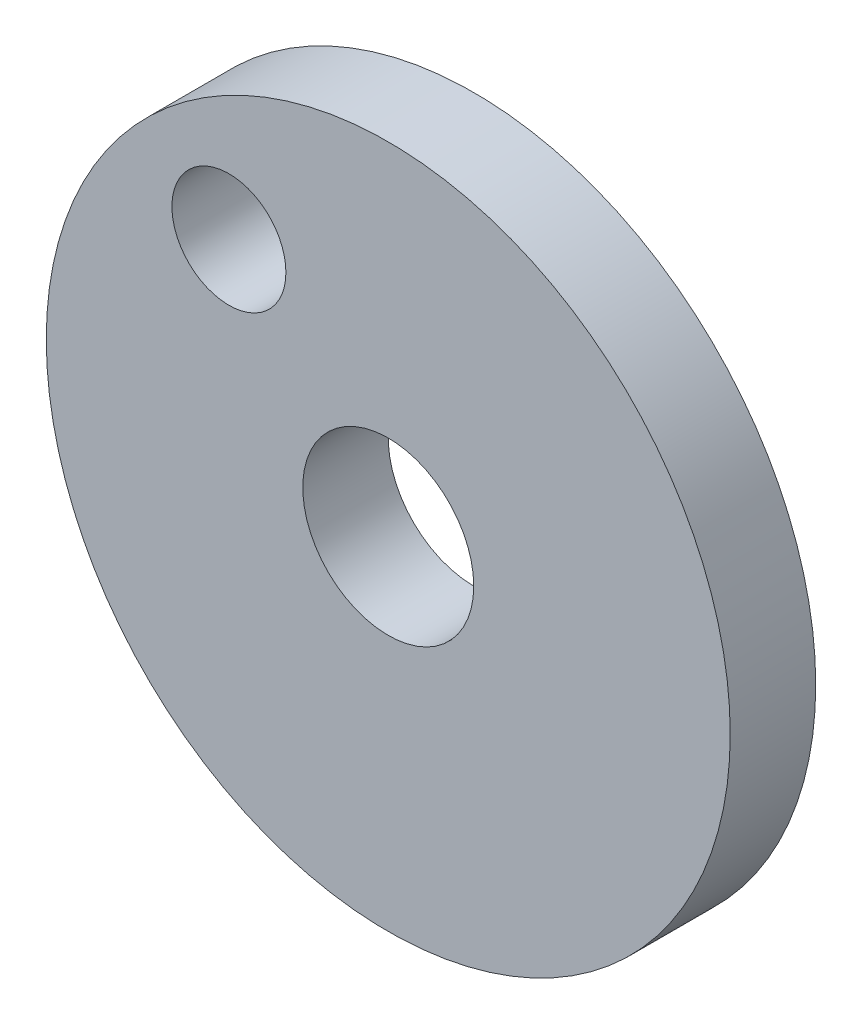
ISO-10303-21;
HEADER;
FILE_DESCRIPTION(('STEP AP214'),'2;1');
FILE_NAME('part.step','',(''),(''),'','','');
FILE_SCHEMA(('AUTOMOTIVE_DESIGN { 1 0 10303 214 1 1 1 1 }'));
ENDSEC;
DATA;
#1=APPLICATION_CONTEXT('core data for automotive mechanical design processes');
#2=APPLICATION_PROTOCOL_DEFINITION('international standard','automotive_design',2000,#1);
#3=PRODUCT_CONTEXT('',#1,'mechanical');
#4=PRODUCT('Part','Part','',(#3));
#5=PRODUCT_RELATED_PRODUCT_CATEGORY('part','',(#4));
#6=PRODUCT_DEFINITION_FORMATION('','',#4);
#7=PRODUCT_DEFINITION_CONTEXT('part definition',#1,'design');
#8=PRODUCT_DEFINITION('design','',#6,#7);
#9=PRODUCT_DEFINITION_SHAPE('','',#8);
#10=(LENGTH_UNIT() NAMED_UNIT(*) SI_UNIT(.MILLI.,.METRE.));
#11=(NAMED_UNIT(*) PLANE_ANGLE_UNIT() SI_UNIT($,.RADIAN.));
#12=(NAMED_UNIT(*) SI_UNIT($,.STERADIAN.) SOLID_ANGLE_UNIT());
#13=UNCERTAINTY_MEASURE_WITH_UNIT(LENGTH_MEASURE(1.E-05),#10,'distance_accuracy_value','');
#14=(GEOMETRIC_REPRESENTATION_CONTEXT(3) GLOBAL_UNCERTAINTY_ASSIGNED_CONTEXT((#13)) GLOBAL_UNIT_ASSIGNED_CONTEXT((#10,
#11,#12)) REPRESENTATION_CONTEXT('',''));
#15=CARTESIAN_POINT('',(0.,0.,0.));
#16=DIRECTION('',(0.,0.,1.));
#17=DIRECTION('',(1.,0.,0.));
#18=AXIS2_PLACEMENT_3D('',#15,#16,#17);
#19=CARTESIAN_POINT('',(0.,0.,15.));
#20=DIRECTION('',(0.,0.,-1.));
#21=DIRECTION('',(-1.,0.,0.));
#22=AXIS2_PLACEMENT_3D('',#19,#20,#21);
#23=CYLINDRICAL_SURFACE('',#22,60.);
#24=CARTESIAN_POINT('',(0.,0.,15.));
#25=DIRECTION('',(0.,0.,1.));
#26=DIRECTION('',(1.,0.,0.));
#27=AXIS2_PLACEMENT_3D('',#24,#25,#26);
#28=CIRCLE('',#27,60.);
#29=CARTESIAN_POINT('',(60.,0.,15.));
#30=VERTEX_POINT('',#29);
#31=EDGE_CURVE('E10',#30,#30,#28,.T.);
#32=ORIENTED_EDGE('',*,*,#31,.F.);
#33=EDGE_LOOP('',(#32));
#34=FACE_BOUND('',#33,.T.);
#35=CARTESIAN_POINT('',(0.,0.,0.));
#36=DIRECTION('',(0.,0.,1.));
#37=DIRECTION('',(1.,0.,0.));
#38=AXIS2_PLACEMENT_3D('',#35,#36,#37);
#39=CIRCLE('',#38,60.);
#40=CARTESIAN_POINT('',(60.,0.,0.));
#41=VERTEX_POINT('',#40);
#42=EDGE_CURVE('E40',#41,#41,#39,.T.);
#43=ORIENTED_EDGE('',*,*,#42,.T.);
#44=EDGE_LOOP('',(#43));
#45=FACE_BOUND('',#44,.T.);
#46=ADVANCED_FACE('F37',(#34,#45),#23,.T.);
#47=CARTESIAN_POINT('',(0.,0.,15.));
#48=DIRECTION('',(0.,0.,1.));
#49=DIRECTION('',(1.,0.,0.));
#50=AXIS2_PLACEMENT_3D('',#47,#48,#49);
#51=PLANE('',#50);
#52=CARTESIAN_POINT('',(-27.9556343875497,31.1812845091901,15.));
#53=DIRECTION('',(0.,0.,1.));
#54=DIRECTION('',(1.,0.,0.));
#55=AXIS2_PLACEMENT_3D('',#52,#53,#54);
#56=CIRCLE('',#55,10.);
#57=CARTESIAN_POINT('',(-17.9556343875497,31.1812845091901,15.));
#58=VERTEX_POINT('',#57);
#59=EDGE_CURVE('E59',#58,#58,#56,.T.);
#60=ORIENTED_EDGE('',*,*,#59,.F.);
#61=EDGE_LOOP('',(#60));
#62=FACE_BOUND('',#61,.T.);
#63=CARTESIAN_POINT('',(0.,0.,15.));
#64=DIRECTION('',(0.,0.,1.));
#65=DIRECTION('',(1.,0.,0.));
#66=AXIS2_PLACEMENT_3D('',#63,#64,#65);
#67=CIRCLE('',#66,15.);
#68=CARTESIAN_POINT('',(15.,0.,15.));
#69=VERTEX_POINT('',#68);
#70=EDGE_CURVE('E51',#69,#69,#67,.T.);
#71=ORIENTED_EDGE('',*,*,#70,.F.);
#72=EDGE_LOOP('',(#71));
#73=FACE_BOUND('',#72,.T.);
#74=ORIENTED_EDGE('',*,*,#31,.T.);
#75=EDGE_LOOP('',(#74));
#76=FACE_BOUND('',#75,.T.);
#77=ADVANCED_FACE('F77',(#62,#73,#76),#51,.T.);
#78=CARTESIAN_POINT('',(0.,0.,0.));
#79=DIRECTION('',(0.,0.,1.));
#80=DIRECTION('',(1.,0.,0.));
#81=AXIS2_PLACEMENT_3D('',#78,#79,#80);
#82=PLANE('',#81);
#83=CARTESIAN_POINT('',(-27.9556343875497,31.1812845091901,0.));
#84=DIRECTION('',(0.,0.,1.));
#85=DIRECTION('',(1.,0.,0.));
#86=AXIS2_PLACEMENT_3D('',#83,#84,#85);
#87=CIRCLE('',#86,10.);
#88=CARTESIAN_POINT('',(-17.9556343875497,31.1812845091901,0.));
#89=VERTEX_POINT('',#88);
#90=EDGE_CURVE('E55',#89,#89,#87,.T.);
#91=ORIENTED_EDGE('',*,*,#90,.T.);
#92=EDGE_LOOP('',(#91));
#93=FACE_BOUND('',#92,.T.);
#94=CARTESIAN_POINT('',(0.,0.,0.));
#95=DIRECTION('',(0.,0.,1.));
#96=DIRECTION('',(1.,0.,0.));
#97=AXIS2_PLACEMENT_3D('',#94,#95,#96);
#98=CIRCLE('',#97,15.);
#99=CARTESIAN_POINT('',(15.,0.,0.));
#100=VERTEX_POINT('',#99);
#101=EDGE_CURVE('E49',#100,#100,#98,.T.);
#102=ORIENTED_EDGE('',*,*,#101,.T.);
#103=EDGE_LOOP('',(#102));
#104=FACE_BOUND('',#103,.T.);
#105=ORIENTED_EDGE('',*,*,#42,.F.);
#106=EDGE_LOOP('',(#105));
#107=FACE_BOUND('',#106,.T.);
#108=ADVANCED_FACE('F67',(#93,#104,#107),#82,.F.);
#109=CARTESIAN_POINT('',(0.,0.,0.));
#110=DIRECTION('',(0.,0.,1.));
#111=DIRECTION('',(1.,0.,0.));
#112=AXIS2_PLACEMENT_3D('',#109,#110,#111);
#113=CYLINDRICAL_SURFACE('',#112,15.);
#114=ORIENTED_EDGE('',*,*,#101,.F.);
#115=EDGE_LOOP('',(#114));
#116=FACE_BOUND('',#115,.T.);
#117=ORIENTED_EDGE('',*,*,#70,.T.);
#118=EDGE_LOOP('',(#117));
#119=FACE_BOUND('',#118,.T.);
#120=ADVANCED_FACE('F73',(#116,#119),#113,.F.);
#121=CARTESIAN_POINT('',(-27.9556343875497,31.1812845091901,0.));
#122=DIRECTION('',(0.,0.,1.));
#123=DIRECTION('',(1.,0.,0.));
#124=AXIS2_PLACEMENT_3D('',#121,#122,#123);
#125=CYLINDRICAL_SURFACE('',#124,10.);
#126=ORIENTED_EDGE('',*,*,#90,.F.);
#127=EDGE_LOOP('',(#126));
#128=FACE_BOUND('',#127,.T.);
#129=ORIENTED_EDGE('',*,*,#59,.T.);
#130=EDGE_LOOP('',(#129));
#131=FACE_BOUND('',#130,.T.);
#132=ADVANCED_FACE('F70',(#128,#131),#125,.F.);
#133=CLOSED_SHELL('',(#46,#77,#108,#120,#132));
#134=MANIFOLD_SOLID_BREP('B2',#133);
#135=ADVANCED_BREP_SHAPE_REPRESENTATION('',(#18,#134),#14);
#136=SHAPE_DEFINITION_REPRESENTATION(#9,#135);
ENDSEC;
END-ISO-10303-21;
